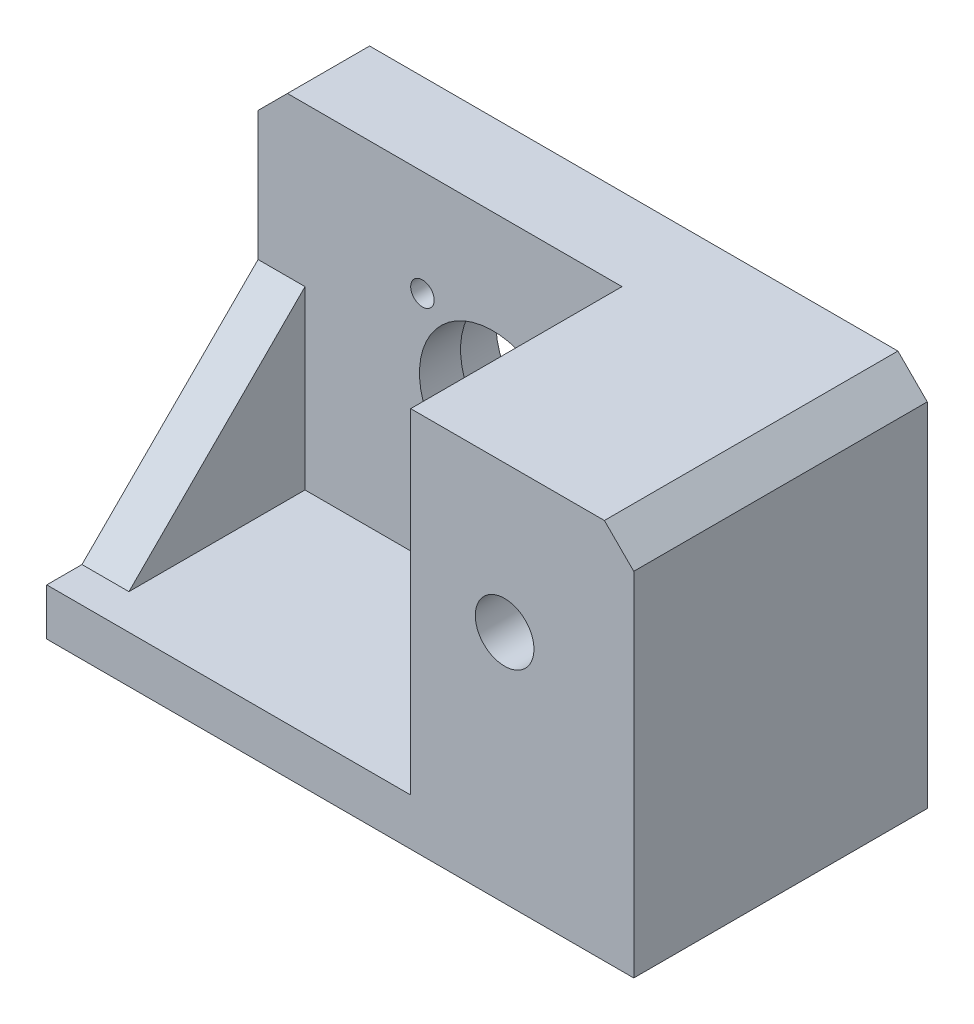
ISO-10303-21;
HEADER;
FILE_DESCRIPTION(('STEP AP214'),'2;1');
FILE_NAME('part.step','',(''),(''),'','','');
FILE_SCHEMA(('AUTOMOTIVE_DESIGN { 1 0 10303 214 1 1 1 1 }'));
ENDSEC;
DATA;
#1=APPLICATION_CONTEXT('core data for automotive mechanical design processes');
#2=APPLICATION_PROTOCOL_DEFINITION('international standard','automotive_design',2000,#1);
#3=PRODUCT_CONTEXT('',#1,'mechanical');
#4=PRODUCT('Part','Part','',(#3));
#5=PRODUCT_RELATED_PRODUCT_CATEGORY('part','',(#4));
#6=PRODUCT_DEFINITION_FORMATION('','',#4);
#7=PRODUCT_DEFINITION_CONTEXT('part definition',#1,'design');
#8=PRODUCT_DEFINITION('design','',#6,#7);
#9=PRODUCT_DEFINITION_SHAPE('','',#8);
#10=(LENGTH_UNIT() NAMED_UNIT(*) SI_UNIT(.MILLI.,.METRE.));
#11=(NAMED_UNIT(*) PLANE_ANGLE_UNIT() SI_UNIT($,.RADIAN.));
#12=(NAMED_UNIT(*) SI_UNIT($,.STERADIAN.) SOLID_ANGLE_UNIT());
#13=UNCERTAINTY_MEASURE_WITH_UNIT(LENGTH_MEASURE(1.E-05),#10,'distance_accuracy_value','');
#14=(GEOMETRIC_REPRESENTATION_CONTEXT(3) GLOBAL_UNCERTAINTY_ASSIGNED_CONTEXT((#13)) GLOBAL_UNIT_ASSIGNED_CONTEXT((#10,
#11,#12)) REPRESENTATION_CONTEXT('',''));
#15=CARTESIAN_POINT('',(0.,0.,0.));
#16=DIRECTION('',(0.,0.,1.));
#17=DIRECTION('',(1.,0.,0.));
#18=AXIS2_PLACEMENT_3D('',#15,#16,#17);
#19=CARTESIAN_POINT('',(0.,0.,14.));
#20=DIRECTION('',(0.,0.,1.));
#21=DIRECTION('',(1.,0.,0.));
#22=AXIS2_PLACEMENT_3D('',#19,#20,#21);
#23=PLANE('',#22);
#24=DIRECTION('',(0.,-1.,0.));
#25=VECTOR('',#24,1.);
#26=CARTESIAN_POINT('',(22.,0.,14.));
#27=LINE('',#26,#25);
#28=CARTESIAN_POINT('',(22.,30.,14.));
#29=VERTEX_POINT('',#28);
#30=CARTESIAN_POINT('',(22.,-27.,14.));
#31=VERTEX_POINT('',#30);
#32=EDGE_CURVE('E147',#29,#31,#27,.T.);
#33=ORIENTED_EDGE('',*,*,#32,.F.);
#34=DIRECTION('',(-1.,0.,0.));
#35=VECTOR('',#34,1.);
#36=CARTESIAN_POINT('',(60.,30.,14.));
#37=LINE('',#36,#35);
#38=CARTESIAN_POINT('',(-35.,30.,14.));
#39=VERTEX_POINT('',#38);
#40=EDGE_CURVE('E136',#29,#39,#37,.T.);
#41=ORIENTED_EDGE('',*,*,#40,.T.);
#42=DIRECTION('',(0.70710678118655,0.707106781186545,0.));
#43=VECTOR('',#42,1.);
#44=CARTESIAN_POINT('',(-32.4999999999999,32.5000000000001,14.));
#45=LINE('',#44,#43);
#46=CARTESIAN_POINT('',(-40.,25.,14.));
#47=VERTEX_POINT('',#46);
#48=EDGE_CURVE('E239',#39,#47,#45,.F.);
#49=ORIENTED_EDGE('',*,*,#48,.T.);
#50=DIRECTION('',(0.,-1.,0.));
#51=VECTOR('',#50,1.);
#52=CARTESIAN_POINT('',(-40.,30.,14.));
#53=LINE('',#52,#51);
#54=CARTESIAN_POINT('',(-40.,2.99999999999998,14.));
#55=VERTEX_POINT('',#54);
#56=EDGE_CURVE('E215',#47,#55,#53,.T.);
#57=ORIENTED_EDGE('',*,*,#56,.T.);
#58=DIRECTION('',(-1.,0.,0.));
#59=VECTOR('',#58,1.);
#60=CARTESIAN_POINT('',(-32.,2.99999999999998,14.));
#61=LINE('',#60,#59);
#62=CARTESIAN_POINT('',(-32.,2.99999999999998,14.));
#63=VERTEX_POINT('',#62);
#64=EDGE_CURVE('E159',#63,#55,#61,.T.);
#65=ORIENTED_EDGE('',*,*,#64,.F.);
#66=DIRECTION('',(0.,1.,0.));
#67=VECTOR('',#66,1.);
#68=CARTESIAN_POINT('',(-32.,-27.,14.));
#69=LINE('',#68,#67);
#70=CARTESIAN_POINT('',(-32.,-27.,14.));
#71=VERTEX_POINT('',#70);
#72=EDGE_CURVE('E155',#71,#63,#69,.T.);
#73=ORIENTED_EDGE('',*,*,#72,.F.);
#74=DIRECTION('',(-1.,0.,0.));
#75=VECTOR('',#74,1.);
#76=CARTESIAN_POINT('',(0.,-27.,14.));
#77=LINE('',#76,#75);
#78=EDGE_CURVE('E175',#31,#71,#77,.T.);
#79=ORIENTED_EDGE('',*,*,#78,.F.);
#80=EDGE_LOOP('',(#33,#41,#49,#57,#65,#73,#79));
#81=FACE_BOUND('',#80,.T.);
#82=CARTESIAN_POINT('',(-12.,12.,14.));
#83=DIRECTION('',(0.,0.,1.));
#84=DIRECTION('',(1.,0.,0.));
#85=AXIS2_PLACEMENT_3D('',#82,#83,#84);
#86=CIRCLE('',#85,1.99999999999999);
#87=CARTESIAN_POINT('',(-10.,12.,14.));
#88=VERTEX_POINT('',#87);
#89=EDGE_CURVE('E178',#88,#88,#86,.T.);
#90=ORIENTED_EDGE('',*,*,#89,.F.);
#91=EDGE_LOOP('',(#90));
#92=FACE_BOUND('',#91,.T.);
#93=CARTESIAN_POINT('',(12.,12.,14.));
#94=DIRECTION('',(0.,0.,1.));
#95=DIRECTION('',(1.,0.,0.));
#96=AXIS2_PLACEMENT_3D('',#93,#94,#95);
#97=CIRCLE('',#96,1.99999999999999);
#98=CARTESIAN_POINT('',(14.,12.,14.));
#99=VERTEX_POINT('',#98);
#100=EDGE_CURVE('E184',#99,#99,#97,.T.);
#101=ORIENTED_EDGE('',*,*,#100,.F.);
#102=EDGE_LOOP('',(#101));
#103=FACE_BOUND('',#102,.T.);
#104=CARTESIAN_POINT('',(12.,-12.,14.));
#105=DIRECTION('',(0.,0.,1.));
#106=DIRECTION('',(1.,0.,0.));
#107=AXIS2_PLACEMENT_3D('',#104,#105,#106);
#108=CIRCLE('',#107,1.99999999999999);
#109=CARTESIAN_POINT('',(14.,-12.,14.));
#110=VERTEX_POINT('',#109);
#111=EDGE_CURVE('E190',#110,#110,#108,.T.);
#112=ORIENTED_EDGE('',*,*,#111,.F.);
#113=EDGE_LOOP('',(#112));
#114=FACE_BOUND('',#113,.T.);
#115=CARTESIAN_POINT('',(-12.,-12.,14.));
#116=DIRECTION('',(0.,0.,1.));
#117=DIRECTION('',(1.,0.,0.));
#118=AXIS2_PLACEMENT_3D('',#115,#116,#117);
#119=CIRCLE('',#118,1.99999999999999);
#120=CARTESIAN_POINT('',(-10.,-12.,14.));
#121=VERTEX_POINT('',#120);
#122=EDGE_CURVE('E196',#121,#121,#119,.T.);
#123=ORIENTED_EDGE('',*,*,#122,.F.);
#124=EDGE_LOOP('',(#123));
#125=FACE_BOUND('',#124,.T.);
#126=CARTESIAN_POINT('',(0.,0.,14.));
#127=DIRECTION('',(0.,0.,1.));
#128=DIRECTION('',(1.,0.,0.));
#129=AXIS2_PLACEMENT_3D('',#126,#127,#128);
#130=CIRCLE('',#129,12.5);
#131=CARTESIAN_POINT('',(12.5,0.,14.));
#132=VERTEX_POINT('',#131);
#133=EDGE_CURVE('E202',#132,#132,#130,.T.);
#134=ORIENTED_EDGE('',*,*,#133,.F.);
#135=EDGE_LOOP('',(#134));
#136=FACE_BOUND('',#135,.T.);
#137=ADVANCED_FACE('F37',(#81,#92,#103,#114,#125,#136),#23,.T.);
#138=CARTESIAN_POINT('',(0.,-27.,0.));
#139=DIRECTION('',(0.,1.,0.));
#140=DIRECTION('',(0.,0.,1.));
#141=AXIS2_PLACEMENT_3D('',#138,#139,#140);
#142=PLANE('',#141);
#143=DIRECTION('',(0.,0.,1.));
#144=VECTOR('',#143,1.);
#145=CARTESIAN_POINT('',(22.,-27.,0.));
#146=LINE('',#145,#144);
#147=CARTESIAN_POINT('',(22.,-27.,50.));
#148=VERTEX_POINT('',#147);
#149=EDGE_CURVE('E139',#31,#148,#146,.T.);
#150=ORIENTED_EDGE('',*,*,#149,.F.);
#151=ORIENTED_EDGE('',*,*,#78,.T.);
#152=DIRECTION('',(0.,0.,-1.));
#153=VECTOR('',#152,1.);
#154=CARTESIAN_POINT('',(-32.,-27.,44.));
#155=LINE('',#154,#153);
#156=CARTESIAN_POINT('',(-32.,-27.,44.));
#157=VERTEX_POINT('',#156);
#158=EDGE_CURVE('E150',#157,#71,#155,.T.);
#159=ORIENTED_EDGE('',*,*,#158,.F.);
#160=DIRECTION('',(-1.,0.,0.));
#161=VECTOR('',#160,1.);
#162=CARTESIAN_POINT('',(-32.,-27.,44.));
#163=LINE('',#162,#161);
#164=CARTESIAN_POINT('',(-40.,-27.,44.));
#165=VERTEX_POINT('',#164);
#166=EDGE_CURVE('E157',#157,#165,#163,.T.);
#167=ORIENTED_EDGE('',*,*,#166,.T.);
#168=DIRECTION('',(0.,0.,-1.));
#169=VECTOR('',#168,1.);
#170=CARTESIAN_POINT('',(-40.,-27.,0.));
#171=LINE('',#170,#169);
#172=CARTESIAN_POINT('',(-40.,-27.,50.));
#173=VERTEX_POINT('',#172);
#174=EDGE_CURVE('E165',#173,#165,#171,.T.);
#175=ORIENTED_EDGE('',*,*,#174,.F.);
#176=DIRECTION('',(-1.,0.,0.));
#177=VECTOR('',#176,1.);
#178=CARTESIAN_POINT('',(-40.,-27.,50.));
#179=LINE('',#178,#177);
#180=EDGE_CURVE('E168',#148,#173,#179,.T.);
#181=ORIENTED_EDGE('',*,*,#180,.F.);
#182=EDGE_LOOP('',(#150,#151,#159,#167,#175,#181));
#183=FACE_BOUND('',#182,.T.);
#184=ADVANCED_FACE('F268',(#183),#142,.T.);
#185=CARTESIAN_POINT('',(0.,0.,14.));
#186=DIRECTION('',(0.,0.,-1.));
#187=DIRECTION('',(-1.,0.,0.));
#188=AXIS2_PLACEMENT_3D('',#185,#186,#187);
#189=CYLINDRICAL_SURFACE('',#188,13.5);
#190=CARTESIAN_POINT('',(0.,0.,0.));
#191=DIRECTION('',(0.,0.,1.));
#192=DIRECTION('',(1.,0.,0.));
#193=AXIS2_PLACEMENT_3D('',#190,#191,#192);
#194=CIRCLE('',#193,13.5);
#195=CARTESIAN_POINT('',(13.5,0.,0.));
#196=VERTEX_POINT('',#195);
#197=EDGE_CURVE('E211',#196,#196,#194,.T.);
#198=ORIENTED_EDGE('',*,*,#197,.F.);
#199=EDGE_LOOP('',(#198));
#200=FACE_BOUND('',#199,.T.);
#201=CARTESIAN_POINT('',(0.,0.,7.));
#202=DIRECTION('',(0.,0.,1.));
#203=DIRECTION('',(1.,0.,0.));
#204=AXIS2_PLACEMENT_3D('',#201,#202,#203);
#205=CIRCLE('',#204,13.5);
#206=CARTESIAN_POINT('',(13.5,0.,7.));
#207=VERTEX_POINT('',#206);
#208=EDGE_CURVE('E206',#207,#207,#205,.T.);
#209=ORIENTED_EDGE('',*,*,#208,.T.);
#210=EDGE_LOOP('',(#209));
#211=FACE_BOUND('',#210,.T.);
#212=ADVANCED_FACE('F291',(#200,#211),#189,.F.);
#213=CARTESIAN_POINT('',(0.,0.,0.));
#214=DIRECTION('',(0.,0.,1.));
#215=DIRECTION('',(1.,0.,0.));
#216=AXIS2_PLACEMENT_3D('',#213,#214,#215);
#217=PLANE('',#216);
#218=CARTESIAN_POINT('',(38.,5.,0.));
#219=DIRECTION('',(0.,0.,-1.));
#220=DIRECTION('',(-1.,0.,0.));
#221=AXIS2_PLACEMENT_3D('',#218,#219,#220);
#222=CIRCLE('',#221,5.);
#223=CARTESIAN_POINT('',(33.,5.,0.));
#224=VERTEX_POINT('',#223);
#225=EDGE_CURVE('E528',#224,#224,#222,.T.);
#226=ORIENTED_EDGE('',*,*,#225,.F.);
#227=EDGE_LOOP('',(#226));
#228=FACE_BOUND('',#227,.T.);
#229=CARTESIAN_POINT('',(-12.,12.,0.));
#230=DIRECTION('',(0.,0.,1.));
#231=DIRECTION('',(1.,0.,0.));
#232=AXIS2_PLACEMENT_3D('',#229,#230,#231);
#233=CIRCLE('',#232,1.99999999999999);
#234=CARTESIAN_POINT('',(-10.,12.,0.));
#235=VERTEX_POINT('',#234);
#236=EDGE_CURVE('E181',#235,#235,#233,.T.);
#237=ORIENTED_EDGE('',*,*,#236,.T.);
#238=EDGE_LOOP('',(#237));
#239=FACE_BOUND('',#238,.T.);
#240=CARTESIAN_POINT('',(12.,12.,0.));
#241=DIRECTION('',(0.,0.,1.));
#242=DIRECTION('',(1.,0.,0.));
#243=AXIS2_PLACEMENT_3D('',#240,#241,#242);
#244=CIRCLE('',#243,1.99999999999999);
#245=CARTESIAN_POINT('',(14.,12.,0.));
#246=VERTEX_POINT('',#245);
#247=EDGE_CURVE('E187',#246,#246,#244,.T.);
#248=ORIENTED_EDGE('',*,*,#247,.T.);
#249=EDGE_LOOP('',(#248));
#250=FACE_BOUND('',#249,.T.);
#251=CARTESIAN_POINT('',(12.,-12.,0.));
#252=DIRECTION('',(0.,0.,1.));
#253=DIRECTION('',(1.,0.,0.));
#254=AXIS2_PLACEMENT_3D('',#251,#252,#253);
#255=CIRCLE('',#254,1.99999999999999);
#256=CARTESIAN_POINT('',(14.,-12.,0.));
#257=VERTEX_POINT('',#256);
#258=EDGE_CURVE('E193',#257,#257,#255,.T.);
#259=ORIENTED_EDGE('',*,*,#258,.T.);
#260=EDGE_LOOP('',(#259));
#261=FACE_BOUND('',#260,.T.);
#262=CARTESIAN_POINT('',(-12.,-12.,0.));
#263=DIRECTION('',(0.,0.,1.));
#264=DIRECTION('',(1.,0.,0.));
#265=AXIS2_PLACEMENT_3D('',#262,#263,#264);
#266=CIRCLE('',#265,1.99999999999999);
#267=CARTESIAN_POINT('',(-10.,-12.,0.));
#268=VERTEX_POINT('',#267);
#269=EDGE_CURVE('E199',#268,#268,#266,.T.);
#270=ORIENTED_EDGE('',*,*,#269,.T.);
#271=EDGE_LOOP('',(#270));
#272=FACE_BOUND('',#271,.T.);
#273=DIRECTION('',(-1.,0.,0.));
#274=VECTOR('',#273,1.);
#275=CARTESIAN_POINT('',(60.,30.,0.));
#276=LINE('',#275,#274);
#277=CARTESIAN_POINT('',(55.,30.,0.));
#278=VERTEX_POINT('',#277);
#279=CARTESIAN_POINT('',(-35.,30.,0.));
#280=VERTEX_POINT('',#279);
#281=EDGE_CURVE('E217',#278,#280,#276,.T.);
#282=ORIENTED_EDGE('',*,*,#281,.F.);
#283=DIRECTION('',(-0.707106781186544,0.707106781186551,0.));
#284=VECTOR('',#283,1.);
#285=CARTESIAN_POINT('',(55.,30.,0.));
#286=LINE('',#285,#284);
#287=CARTESIAN_POINT('',(60.,24.9999999999999,0.));
#288=VERTEX_POINT('',#287);
#289=EDGE_CURVE('E60',#278,#288,#286,.F.);
#290=ORIENTED_EDGE('',*,*,#289,.T.);
#291=DIRECTION('',(0.,1.,0.));
#292=VECTOR('',#291,1.);
#293=CARTESIAN_POINT('',(60.,3.08001347194307,0.));
#294=LINE('',#293,#292);
#295=CARTESIAN_POINT('',(60.,-35.,0.));
#296=VERTEX_POINT('',#295);
#297=EDGE_CURVE('E224',#296,#288,#294,.T.);
#298=ORIENTED_EDGE('',*,*,#297,.F.);
#299=DIRECTION('',(1.,0.,0.));
#300=VECTOR('',#299,1.);
#301=CARTESIAN_POINT('',(-40.,-35.,0.));
#302=LINE('',#301,#300);
#303=CARTESIAN_POINT('',(-40.,-35.,0.));
#304=VERTEX_POINT('',#303);
#305=EDGE_CURVE('E221',#304,#296,#302,.T.);
#306=ORIENTED_EDGE('',*,*,#305,.F.);
#307=DIRECTION('',(0.,-1.,0.));
#308=VECTOR('',#307,1.);
#309=CARTESIAN_POINT('',(-40.,0.,0.));
#310=LINE('',#309,#308);
#311=CARTESIAN_POINT('',(-40.,25.,0.));
#312=VERTEX_POINT('',#311);
#313=EDGE_CURVE('E214',#312,#304,#310,.T.);
#314=ORIENTED_EDGE('',*,*,#313,.F.);
#315=DIRECTION('',(-0.70710678118655,-0.707106781186545,0.));
#316=VECTOR('',#315,1.);
#317=CARTESIAN_POINT('',(-40.,25.,0.));
#318=LINE('',#317,#316);
#319=EDGE_CURVE('E234',#312,#280,#318,.F.);
#320=ORIENTED_EDGE('',*,*,#319,.T.);
#321=EDGE_LOOP('',(#282,#290,#298,#306,#314,#320));
#322=FACE_BOUND('',#321,.T.);
#323=ORIENTED_EDGE('',*,*,#197,.T.);
#324=EDGE_LOOP('',(#323));
#325=FACE_BOUND('',#324,.T.);
#326=ADVANCED_FACE('F244',(#228,#239,#250,#261,#272,#322,#325),#217,.F.);
#327=CARTESIAN_POINT('',(-40.,0.,14.));
#328=DIRECTION('',(1.,0.,0.));
#329=DIRECTION('',(0.,1.,0.));
#330=AXIS2_PLACEMENT_3D('',#327,#328,#329);
#331=PLANE('',#330);
#332=ORIENTED_EDGE('',*,*,#56,.F.);
#333=DIRECTION('',(0.,0.,-1.));
#334=VECTOR('',#333,1.);
#335=CARTESIAN_POINT('',(-40.,25.,14.));
#336=LINE('',#335,#334);
#337=EDGE_CURVE('E231',#47,#312,#336,.T.);
#338=ORIENTED_EDGE('',*,*,#337,.T.);
#339=ORIENTED_EDGE('',*,*,#313,.T.);
#340=DIRECTION('',(0.,0.,-1.));
#341=VECTOR('',#340,1.);
#342=CARTESIAN_POINT('',(-40.,-35.,14.));
#343=LINE('',#342,#341);
#344=CARTESIAN_POINT('',(-40.,-35.,50.));
#345=VERTEX_POINT('',#344);
#346=EDGE_CURVE('E228',#345,#304,#343,.T.);
#347=ORIENTED_EDGE('',*,*,#346,.F.);
#348=DIRECTION('',(0.,-1.,0.));
#349=VECTOR('',#348,1.);
#350=CARTESIAN_POINT('',(-40.,-27.,50.));
#351=LINE('',#350,#349);
#352=EDGE_CURVE('E172',#173,#345,#351,.T.);
#353=ORIENTED_EDGE('',*,*,#352,.F.);
#354=ORIENTED_EDGE('',*,*,#174,.T.);
#355=DIRECTION('',(0.,-0.707106781186547,0.707106781186548));
#356=VECTOR('',#355,1.);
#357=CARTESIAN_POINT('',(-40.,-27.,44.));
#358=LINE('',#357,#356);
#359=EDGE_CURVE('E149',#55,#165,#358,.T.);
#360=ORIENTED_EDGE('',*,*,#359,.F.);
#361=EDGE_LOOP('',(#332,#338,#339,#347,#353,#354,#360));
#362=FACE_BOUND('',#361,.T.);
#363=ADVANCED_FACE('F259',(#362),#331,.F.);
#364=CARTESIAN_POINT('',(-40.,-35.,14.));
#365=DIRECTION('',(0.,1.,0.));
#366=DIRECTION('',(0.,0.,1.));
#367=AXIS2_PLACEMENT_3D('',#364,#365,#366);
#368=PLANE('',#367);
#369=DIRECTION('',(-1.,0.,0.));
#370=VECTOR('',#369,1.);
#371=CARTESIAN_POINT('',(-40.,-35.,50.));
#372=LINE('',#371,#370);
#373=CARTESIAN_POINT('',(60.,-35.,50.));
#374=VERTEX_POINT('',#373);
#375=EDGE_CURVE('E162',#374,#345,#372,.T.);
#376=ORIENTED_EDGE('',*,*,#375,.T.);
#377=ORIENTED_EDGE('',*,*,#346,.T.);
#378=ORIENTED_EDGE('',*,*,#305,.T.);
#379=DIRECTION('',(0.,0.,-1.));
#380=VECTOR('',#379,1.);
#381=CARTESIAN_POINT('',(60.,-35.,14.));
#382=LINE('',#381,#380);
#383=EDGE_CURVE('E219',#374,#296,#382,.T.);
#384=ORIENTED_EDGE('',*,*,#383,.F.);
#385=EDGE_LOOP('',(#376,#377,#378,#384));
#386=FACE_BOUND('',#385,.T.);
#387=ADVANCED_FACE('F276',(#386),#368,.F.);
#388=CARTESIAN_POINT('',(60.,3.08001347194307,14.));
#389=DIRECTION('',(-1.,0.,0.));
#390=DIRECTION('',(0.,0.,1.));
#391=AXIS2_PLACEMENT_3D('',#388,#389,#390);
#392=PLANE('',#391);
#393=ORIENTED_EDGE('',*,*,#297,.T.);
#394=DIRECTION('',(0.,0.,1.));
#395=VECTOR('',#394,1.);
#396=CARTESIAN_POINT('',(60.,24.9999999999999,14.));
#397=LINE('',#396,#395);
#398=CARTESIAN_POINT('',(60.,24.9999999999999,50.));
#399=VERTEX_POINT('',#398);
#400=EDGE_CURVE('E46',#288,#399,#397,.T.);
#401=ORIENTED_EDGE('',*,*,#400,.T.);
#402=DIRECTION('',(0.,-1.,0.));
#403=VECTOR('',#402,1.);
#404=CARTESIAN_POINT('',(60.,-27.,50.));
#405=LINE('',#404,#403);
#406=EDGE_CURVE('E170',#399,#374,#405,.T.);
#407=ORIENTED_EDGE('',*,*,#406,.T.);
#408=ORIENTED_EDGE('',*,*,#383,.T.);
#409=EDGE_LOOP('',(#393,#401,#407,#408));
#410=FACE_BOUND('',#409,.T.);
#411=ADVANCED_FACE('F278',(#410),#392,.F.);
#412=CARTESIAN_POINT('',(60.,30.,14.));
#413=DIRECTION('',(0.,-1.,0.));
#414=DIRECTION('',(1.,0.,0.));
#415=AXIS2_PLACEMENT_3D('',#412,#413,#414);
#416=PLANE('',#415);
#417=DIRECTION('',(-1.,0.,0.));
#418=VECTOR('',#417,1.);
#419=CARTESIAN_POINT('',(60.,30.,50.));
#420=LINE('',#419,#418);
#421=CARTESIAN_POINT('',(55.,30.,50.));
#422=VERTEX_POINT('',#421);
#423=CARTESIAN_POINT('',(22.,30.,50.));
#424=VERTEX_POINT('',#423);
#425=EDGE_CURVE('E120',#422,#424,#420,.T.);
#426=ORIENTED_EDGE('',*,*,#425,.F.);
#427=DIRECTION('',(0.,0.,-1.));
#428=VECTOR('',#427,1.);
#429=CARTESIAN_POINT('',(55.,30.,14.));
#430=LINE('',#429,#428);
#431=EDGE_CURVE('E241',#422,#278,#430,.T.);
#432=ORIENTED_EDGE('',*,*,#431,.T.);
#433=ORIENTED_EDGE('',*,*,#281,.T.);
#434=DIRECTION('',(0.,0.,1.));
#435=VECTOR('',#434,1.);
#436=CARTESIAN_POINT('',(-35.,30.,14.));
#437=LINE('',#436,#435);
#438=EDGE_CURVE('E237',#280,#39,#437,.T.);
#439=ORIENTED_EDGE('',*,*,#438,.T.);
#440=ORIENTED_EDGE('',*,*,#40,.F.);
#441=DIRECTION('',(0.,0.,1.));
#442=VECTOR('',#441,1.);
#443=CARTESIAN_POINT('',(22.,30.,6.00000000000002));
#444=LINE('',#443,#442);
#445=EDGE_CURVE('E133',#29,#424,#444,.T.);
#446=ORIENTED_EDGE('',*,*,#445,.T.);
#447=EDGE_LOOP('',(#426,#432,#433,#439,#440,#446));
#448=FACE_BOUND('',#447,.T.);
#449=ADVANCED_FACE('F134',(#448),#416,.F.);
#450=CARTESIAN_POINT('',(0.,0.,7.));
#451=DIRECTION('',(0.,0.,1.));
#452=DIRECTION('',(1.,0.,0.));
#453=AXIS2_PLACEMENT_3D('',#450,#451,#452);
#454=PLANE('',#453);
#455=CARTESIAN_POINT('',(0.,0.,7.));
#456=DIRECTION('',(0.,0.,1.));
#457=DIRECTION('',(1.,0.,0.));
#458=AXIS2_PLACEMENT_3D('',#455,#456,#457);
#459=CIRCLE('',#458,12.5);
#460=CARTESIAN_POINT('',(12.5,0.,7.));
#461=VERTEX_POINT('',#460);
#462=EDGE_CURVE('E203',#461,#461,#459,.T.);
#463=ORIENTED_EDGE('',*,*,#462,.T.);
#464=EDGE_LOOP('',(#463));
#465=FACE_BOUND('',#464,.T.);
#466=ORIENTED_EDGE('',*,*,#208,.F.);
#467=EDGE_LOOP('',(#466));
#468=FACE_BOUND('',#467,.T.);
#469=ADVANCED_FACE('F301',(#465,#468),#454,.F.);
#470=CARTESIAN_POINT('',(0.,0.,7.));
#471=DIRECTION('',(0.,0.,1.));
#472=DIRECTION('',(1.,0.,0.));
#473=AXIS2_PLACEMENT_3D('',#470,#471,#472);
#474=CYLINDRICAL_SURFACE('',#473,12.5);
#475=ORIENTED_EDGE('',*,*,#462,.F.);
#476=EDGE_LOOP('',(#475));
#477=FACE_BOUND('',#476,.T.);
#478=ORIENTED_EDGE('',*,*,#133,.T.);
#479=EDGE_LOOP('',(#478));
#480=FACE_BOUND('',#479,.T.);
#481=ADVANCED_FACE('F340',(#477,#480),#474,.F.);
#482=CARTESIAN_POINT('',(-12.,-12.,14.));
#483=DIRECTION('',(0.,0.,1.));
#484=DIRECTION('',(1.,0.,0.));
#485=AXIS2_PLACEMENT_3D('',#482,#483,#484);
#486=CYLINDRICAL_SURFACE('',#485,1.99999999999999);
#487=ORIENTED_EDGE('',*,*,#269,.F.);
#488=EDGE_LOOP('',(#487));
#489=FACE_BOUND('',#488,.T.);
#490=ORIENTED_EDGE('',*,*,#122,.T.);
#491=EDGE_LOOP('',(#490));
#492=FACE_BOUND('',#491,.T.);
#493=ADVANCED_FACE('F336',(#489,#492),#486,.F.);
#494=CARTESIAN_POINT('',(12.,-12.,14.));
#495=DIRECTION('',(0.,0.,1.));
#496=DIRECTION('',(1.,0.,0.));
#497=AXIS2_PLACEMENT_3D('',#494,#495,#496);
#498=CYLINDRICAL_SURFACE('',#497,1.99999999999999);
#499=ORIENTED_EDGE('',*,*,#258,.F.);
#500=EDGE_LOOP('',(#499));
#501=FACE_BOUND('',#500,.T.);
#502=ORIENTED_EDGE('',*,*,#111,.T.);
#503=EDGE_LOOP('',(#502));
#504=FACE_BOUND('',#503,.T.);
#505=ADVANCED_FACE('F332',(#501,#504),#498,.F.);
#506=CARTESIAN_POINT('',(12.,12.,14.));
#507=DIRECTION('',(0.,0.,1.));
#508=DIRECTION('',(1.,0.,0.));
#509=AXIS2_PLACEMENT_3D('',#506,#507,#508);
#510=CYLINDRICAL_SURFACE('',#509,1.99999999999999);
#511=ORIENTED_EDGE('',*,*,#247,.F.);
#512=EDGE_LOOP('',(#511));
#513=FACE_BOUND('',#512,.T.);
#514=ORIENTED_EDGE('',*,*,#100,.T.);
#515=EDGE_LOOP('',(#514));
#516=FACE_BOUND('',#515,.T.);
#517=ADVANCED_FACE('F328',(#513,#516),#510,.F.);
#518=CARTESIAN_POINT('',(-12.,12.,14.));
#519=DIRECTION('',(0.,0.,1.));
#520=DIRECTION('',(1.,0.,0.));
#521=AXIS2_PLACEMENT_3D('',#518,#519,#520);
#522=CYLINDRICAL_SURFACE('',#521,1.99999999999999);
#523=ORIENTED_EDGE('',*,*,#236,.F.);
#524=EDGE_LOOP('',(#523));
#525=FACE_BOUND('',#524,.T.);
#526=ORIENTED_EDGE('',*,*,#89,.T.);
#527=EDGE_LOOP('',(#526));
#528=FACE_BOUND('',#527,.T.);
#529=ADVANCED_FACE('F324',(#525,#528),#522,.F.);
#530=CARTESIAN_POINT('',(-40.,-27.,50.));
#531=DIRECTION('',(0.,0.,1.));
#532=DIRECTION('',(1.,0.,0.));
#533=AXIS2_PLACEMENT_3D('',#530,#531,#532);
#534=PLANE('',#533);
#535=CARTESIAN_POINT('',(38.,5.,50.));
#536=DIRECTION('',(0.,0.,-1.));
#537=DIRECTION('',(-1.,0.,0.));
#538=AXIS2_PLACEMENT_3D('',#535,#536,#537);
#539=CIRCLE('',#538,5.);
#540=CARTESIAN_POINT('',(33.,5.,50.));
#541=VERTEX_POINT('',#540);
#542=EDGE_CURVE('E130',#541,#541,#539,.T.);
#543=ORIENTED_EDGE('',*,*,#542,.T.);
#544=EDGE_LOOP('',(#543));
#545=FACE_BOUND('',#544,.T.);
#546=ORIENTED_EDGE('',*,*,#406,.F.);
#547=DIRECTION('',(0.707106781186544,-0.707106781186551,0.));
#548=VECTOR('',#547,1.);
#549=CARTESIAN_POINT('',(36.0000000000005,48.9999999999997,50.));
#550=LINE('',#549,#548);
#551=EDGE_CURVE('E11',#399,#422,#550,.F.);
#552=ORIENTED_EDGE('',*,*,#551,.T.);
#553=ORIENTED_EDGE('',*,*,#425,.T.);
#554=DIRECTION('',(0.,-1.,0.));
#555=VECTOR('',#554,1.);
#556=CARTESIAN_POINT('',(22.,-35.,50.));
#557=LINE('',#556,#555);
#558=EDGE_CURVE('E124',#424,#148,#557,.T.);
#559=ORIENTED_EDGE('',*,*,#558,.T.);
#560=ORIENTED_EDGE('',*,*,#180,.T.);
#561=ORIENTED_EDGE('',*,*,#352,.T.);
#562=ORIENTED_EDGE('',*,*,#375,.F.);
#563=EDGE_LOOP('',(#546,#552,#553,#559,#560,#561,#562));
#564=FACE_BOUND('',#563,.T.);
#565=ADVANCED_FACE('F122',(#545,#564),#534,.T.);
#566=CARTESIAN_POINT('',(-32.,-27.,44.));
#567=DIRECTION('',(0.,-0.707106781186548,-0.707106781186547));
#568=DIRECTION('',(0.,0.707106781186547,-0.707106781186548));
#569=AXIS2_PLACEMENT_3D('',#566,#567,#568);
#570=PLANE('',#569);
#571=ORIENTED_EDGE('',*,*,#359,.T.);
#572=ORIENTED_EDGE('',*,*,#166,.F.);
#573=DIRECTION('',(0.,-0.707106781186547,0.707106781186548));
#574=VECTOR('',#573,1.);
#575=CARTESIAN_POINT('',(-32.,-27.,44.));
#576=LINE('',#575,#574);
#577=EDGE_CURVE('E153',#63,#157,#576,.T.);
#578=ORIENTED_EDGE('',*,*,#577,.F.);
#579=ORIENTED_EDGE('',*,*,#64,.T.);
#580=EDGE_LOOP('',(#571,#572,#578,#579));
#581=FACE_BOUND('',#580,.T.);
#582=ADVANCED_FACE('F264',(#581),#570,.F.);
#583=CARTESIAN_POINT('',(-32.,0.,0.));
#584=DIRECTION('',(-1.,0.,0.));
#585=DIRECTION('',(0.,0.,-1.));
#586=AXIS2_PLACEMENT_3D('',#583,#584,#585);
#587=PLANE('',#586);
#588=ORIENTED_EDGE('',*,*,#158,.T.);
#589=ORIENTED_EDGE('',*,*,#72,.T.);
#590=ORIENTED_EDGE('',*,*,#577,.T.);
#591=EDGE_LOOP('',(#588,#589,#590));
#592=FACE_BOUND('',#591,.T.);
#593=ADVANCED_FACE('F272',(#592),#587,.F.);
#594=CARTESIAN_POINT('',(-40.,25.,14.));
#595=DIRECTION('',(0.707106781186545,-0.70710678118655,0.));
#596=DIRECTION('',(0.,0.,-1.));
#597=AXIS2_PLACEMENT_3D('',#594,#595,#596);
#598=PLANE('',#597);
#599=ORIENTED_EDGE('',*,*,#48,.F.);
#600=ORIENTED_EDGE('',*,*,#438,.F.);
#601=ORIENTED_EDGE('',*,*,#319,.F.);
#602=ORIENTED_EDGE('',*,*,#337,.F.);
#603=EDGE_LOOP('',(#599,#600,#601,#602));
#604=FACE_BOUND('',#603,.T.);
#605=ADVANCED_FACE('F252',(#604),#598,.F.);
#606=CARTESIAN_POINT('',(22.,-35.,6.00000000000002));
#607=DIRECTION('',(-1.,0.,0.));
#608=DIRECTION('',(0.,0.,1.));
#609=AXIS2_PLACEMENT_3D('',#606,#607,#608);
#610=PLANE('',#609);
#611=ORIENTED_EDGE('',*,*,#445,.F.);
#612=ORIENTED_EDGE('',*,*,#32,.T.);
#613=ORIENTED_EDGE('',*,*,#149,.T.);
#614=ORIENTED_EDGE('',*,*,#558,.F.);
#615=EDGE_LOOP('',(#611,#612,#613,#614));
#616=FACE_BOUND('',#615,.T.);
#617=ADVANCED_FACE('F141',(#616),#610,.T.);
#618=CARTESIAN_POINT('',(38.,5.,50.));
#619=DIRECTION('',(0.,0.,-1.));
#620=DIRECTION('',(-1.,0.,0.));
#621=AXIS2_PLACEMENT_3D('',#618,#619,#620);
#622=CYLINDRICAL_SURFACE('',#621,5.);
#623=ORIENTED_EDGE('',*,*,#542,.F.);
#624=EDGE_LOOP('',(#623));
#625=FACE_BOUND('',#624,.T.);
#626=ORIENTED_EDGE('',*,*,#225,.T.);
#627=EDGE_LOOP('',(#626));
#628=FACE_BOUND('',#627,.T.);
#629=ADVANCED_FACE('F280',(#625,#628),#622,.F.);
#630=CARTESIAN_POINT('',(55.,30.,14.));
#631=DIRECTION('',(-0.707106781186551,-0.707106781186544,0.));
#632=DIRECTION('',(0.,0.,-1.));
#633=AXIS2_PLACEMENT_3D('',#630,#631,#632);
#634=PLANE('',#633);
#635=ORIENTED_EDGE('',*,*,#551,.F.);
#636=ORIENTED_EDGE('',*,*,#400,.F.);
#637=ORIENTED_EDGE('',*,*,#289,.F.);
#638=ORIENTED_EDGE('',*,*,#431,.F.);
#639=EDGE_LOOP('',(#635,#636,#637,#638));
#640=FACE_BOUND('',#639,.T.);
#641=ADVANCED_FACE('F40',(#640),#634,.F.);
#642=CLOSED_SHELL('',(#137,#184,#212,#326,#363,#387,#411,#449,#469,#481,#493,#505,#517,#529,
#565,#582,#593,#605,#617,#629,#641));
#643=MANIFOLD_SOLID_BREP('B2',#642);
#644=ADVANCED_BREP_SHAPE_REPRESENTATION('',(#18,#643),#14);
#645=SHAPE_DEFINITION_REPRESENTATION(#9,#644);
ENDSEC;
END-ISO-10303-21;
